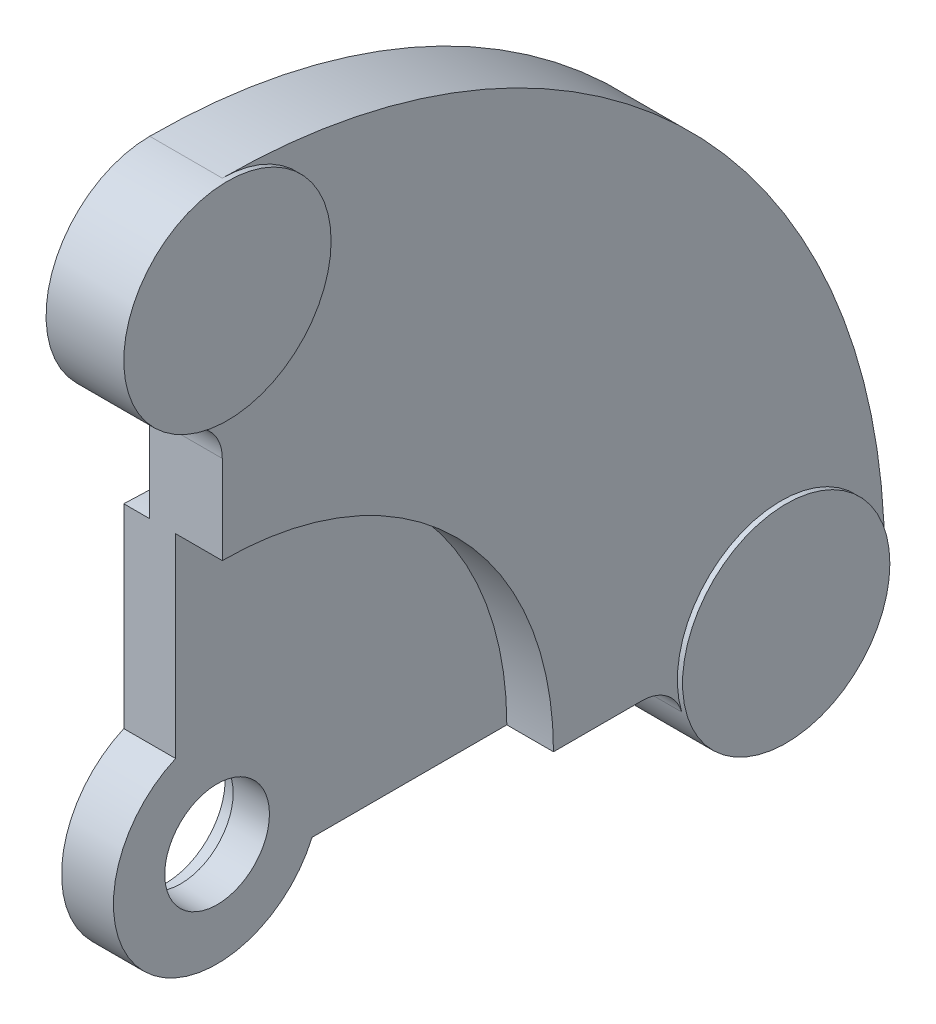
ISO-10303-21;
HEADER;
FILE_DESCRIPTION(('STEP AP214'),'2;1');
FILE_NAME('part.step','',(''),(''),'','','');
FILE_SCHEMA(('AUTOMOTIVE_DESIGN { 1 0 10303 214 1 1 1 1 }'));
ENDSEC;
DATA;
#1=APPLICATION_CONTEXT('core data for automotive mechanical design processes');
#2=APPLICATION_PROTOCOL_DEFINITION('international standard','automotive_design',2000,#1);
#3=PRODUCT_CONTEXT('',#1,'mechanical');
#4=PRODUCT('Part','Part','',(#3));
#5=PRODUCT_RELATED_PRODUCT_CATEGORY('part','',(#4));
#6=PRODUCT_DEFINITION_FORMATION('','',#4);
#7=PRODUCT_DEFINITION_CONTEXT('part definition',#1,'design');
#8=PRODUCT_DEFINITION('design','',#6,#7);
#9=PRODUCT_DEFINITION_SHAPE('','',#8);
#10=(LENGTH_UNIT() NAMED_UNIT(*) SI_UNIT(.MILLI.,.METRE.));
#11=(NAMED_UNIT(*) PLANE_ANGLE_UNIT() SI_UNIT($,.RADIAN.));
#12=(NAMED_UNIT(*) SI_UNIT($,.STERADIAN.) SOLID_ANGLE_UNIT());
#13=UNCERTAINTY_MEASURE_WITH_UNIT(LENGTH_MEASURE(1.E-05),#10,'distance_accuracy_value','');
#14=(GEOMETRIC_REPRESENTATION_CONTEXT(3) GLOBAL_UNCERTAINTY_ASSIGNED_CONTEXT((#13)) GLOBAL_UNIT_ASSIGNED_CONTEXT((#10,
#11,#12)) REPRESENTATION_CONTEXT('',''));
#15=CARTESIAN_POINT('',(0.,0.,0.));
#16=DIRECTION('',(0.,0.,1.));
#17=DIRECTION('',(1.,0.,0.));
#18=AXIS2_PLACEMENT_3D('',#15,#16,#17);
#19=CARTESIAN_POINT('',(-128.5,4.,-4.));
#20=DIRECTION('',(1.,0.,0.));
#21=DIRECTION('',(0.,0.,-1.));
#22=AXIS2_PLACEMENT_3D('',#19,#20,#21);
#23=CYLINDRICAL_SURFACE('',#22,5.05);
#24=CARTESIAN_POINT('',(2.5,4.,-4.));
#25=DIRECTION('',(1.,0.,0.));
#26=DIRECTION('',(0.,0.,-1.));
#27=AXIS2_PLACEMENT_3D('',#24,#25,#26);
#28=CIRCLE('',#27,5.05);
#29=CARTESIAN_POINT('',(2.5,4.,-9.05));
#30=VERTEX_POINT('',#29);
#31=EDGE_CURVE('E262',#30,#30,#28,.T.);
#32=ORIENTED_EDGE('',*,*,#31,.T.);
#33=EDGE_LOOP('',(#32));
#34=FACE_BOUND('',#33,.T.);
#35=CARTESIAN_POINT('',(-1.,4.,-4.));
#36=DIRECTION('',(-1.,0.,0.));
#37=DIRECTION('',(0.,0.,1.));
#38=AXIS2_PLACEMENT_3D('',#35,#36,#37);
#39=CIRCLE('',#38,5.05);
#40=CARTESIAN_POINT('',(-1.,4.,1.05));
#41=VERTEX_POINT('',#40);
#42=EDGE_CURVE('E53',#41,#41,#39,.F.);
#43=ORIENTED_EDGE('',*,*,#42,.F.);
#44=EDGE_LOOP('',(#43));
#45=FACE_BOUND('',#44,.T.);
#46=ADVANCED_FACE('F49',(#34,#45),#23,.F.);
#47=CARTESIAN_POINT('',(2.5,0.,0.));
#48=DIRECTION('',(-1.,0.,0.));
#49=DIRECTION('',(0.,0.,1.));
#50=AXIS2_PLACEMENT_3D('',#47,#48,#49);
#51=CYLINDRICAL_SURFACE('',#50,31.95);
#52=CARTESIAN_POINT('',(0.,0.,0.));
#53=DIRECTION('',(1.,0.,0.));
#54=DIRECTION('',(0.,0.,-1.));
#55=AXIS2_PLACEMENT_3D('',#52,#53,#54);
#56=CIRCLE('',#55,31.95);
#57=CARTESIAN_POINT('',(0.,0.,-31.95));
#58=VERTEX_POINT('',#57);
#59=CARTESIAN_POINT('',(0.,31.95,0.));
#60=VERTEX_POINT('',#59);
#61=EDGE_CURVE('E224',#58,#60,#56,.T.);
#62=ORIENTED_EDGE('',*,*,#61,.F.);
#63=DIRECTION('',(-1.,0.,0.));
#64=VECTOR('',#63,1.);
#65=CARTESIAN_POINT('',(2.5,0.,-31.95));
#66=LINE('',#65,#64);
#67=CARTESIAN_POINT('',(-2.5,0.,-31.95));
#68=VERTEX_POINT('',#67);
#69=EDGE_CURVE('E176',#58,#68,#66,.T.);
#70=ORIENTED_EDGE('',*,*,#69,.T.);
#71=CARTESIAN_POINT('',(-2.5,0.,0.));
#72=DIRECTION('',(1.,0.,0.));
#73=DIRECTION('',(0.,0.,-1.));
#74=AXIS2_PLACEMENT_3D('',#71,#72,#73);
#75=CIRCLE('',#74,31.95);
#76=CARTESIAN_POINT('',(-2.5,31.95,0.));
#77=VERTEX_POINT('',#76);
#78=EDGE_CURVE('E162',#68,#77,#75,.T.);
#79=ORIENTED_EDGE('',*,*,#78,.T.);
#80=DIRECTION('',(-1.,0.,0.));
#81=VECTOR('',#80,1.);
#82=CARTESIAN_POINT('',(2.5,31.95,0.));
#83=LINE('',#82,#81);
#84=EDGE_CURVE('E174',#60,#77,#83,.T.);
#85=ORIENTED_EDGE('',*,*,#84,.F.);
#86=EDGE_LOOP('',(#62,#70,#79,#85));
#87=FACE_BOUND('',#86,.T.);
#88=ADVANCED_FACE('F278',(#87),#51,.T.);
#89=CARTESIAN_POINT('',(2.5,0.,0.));
#90=DIRECTION('',(0.,1.,0.));
#91=DIRECTION('',(0.,0.,1.));
#92=AXIS2_PLACEMENT_3D('',#89,#90,#91);
#93=PLANE('',#92);
#94=DIRECTION('',(0.,0.,-1.));
#95=VECTOR('',#94,1.);
#96=CARTESIAN_POINT('',(2.5,0.,0.));
#97=LINE('',#96,#95);
#98=CARTESIAN_POINT('',(2.5,0.,-13.1651513899117));
#99=VERTEX_POINT('',#98);
#100=CARTESIAN_POINT('',(2.5,0.,-31.95));
#101=VERTEX_POINT('',#100);
#102=EDGE_CURVE('E156',#99,#101,#97,.T.);
#103=ORIENTED_EDGE('',*,*,#102,.F.);
#104=DIRECTION('',(1.,0.,0.));
#105=VECTOR('',#104,1.);
#106=CARTESIAN_POINT('',(-30.7842712474619,0.,-13.1651513899117));
#107=LINE('',#106,#105);
#108=CARTESIAN_POINT('',(-2.5,0.,-13.1651513899117));
#109=VERTEX_POINT('',#108);
#110=EDGE_CURVE('E139',#99,#109,#107,.F.);
#111=ORIENTED_EDGE('',*,*,#110,.T.);
#112=DIRECTION('',(0.,0.,-1.));
#113=VECTOR('',#112,1.);
#114=CARTESIAN_POINT('',(-2.5,0.,0.));
#115=LINE('',#114,#113);
#116=EDGE_CURVE('E153',#109,#68,#115,.T.);
#117=ORIENTED_EDGE('',*,*,#116,.T.);
#118=ORIENTED_EDGE('',*,*,#69,.F.);
#119=DIRECTION('',(0.,0.,-1.));
#120=VECTOR('',#119,1.);
#121=CARTESIAN_POINT('',(0.,0.,0.));
#122=LINE('',#121,#120);
#123=CARTESIAN_POINT('',(0.,0.,-40.4835921350013));
#124=VERTEX_POINT('',#123);
#125=EDGE_CURVE('E239',#58,#124,#122,.T.);
#126=ORIENTED_EDGE('',*,*,#125,.T.);
#127=DIRECTION('',(1.,0.,0.));
#128=VECTOR('',#127,1.);
#129=CARTESIAN_POINT('',(7.,0.,-40.4835921350013));
#130=LINE('',#129,#128);
#131=CARTESIAN_POINT('',(7.,0.,-40.4835921350013));
#132=VERTEX_POINT('',#131);
#133=EDGE_CURVE('E181',#124,#132,#130,.T.);
#134=ORIENTED_EDGE('',*,*,#133,.T.);
#135=DIRECTION('',(0.,0.,-1.));
#136=VECTOR('',#135,1.);
#137=CARTESIAN_POINT('',(7.,0.,0.));
#138=LINE('',#137,#136);
#139=CARTESIAN_POINT('',(7.,0.,-31.95));
#140=VERTEX_POINT('',#139);
#141=EDGE_CURVE('E201',#140,#132,#138,.T.);
#142=ORIENTED_EDGE('',*,*,#141,.F.);
#143=DIRECTION('',(-1.,0.,0.));
#144=VECTOR('',#143,1.);
#145=CARTESIAN_POINT('',(7.,0.,-31.95));
#146=LINE('',#145,#144);
#147=EDGE_CURVE('E163',#140,#101,#146,.T.);
#148=ORIENTED_EDGE('',*,*,#147,.T.);
#149=EDGE_LOOP('',(#103,#111,#117,#118,#126,#134,#142,#148));
#150=FACE_BOUND('',#149,.T.);
#151=ADVANCED_FACE('F151',(#150),#93,.F.);
#152=CARTESIAN_POINT('',(2.5,0.,0.));
#153=DIRECTION('',(0.,0.,-1.));
#154=DIRECTION('',(-1.,0.,0.));
#155=AXIS2_PLACEMENT_3D('',#152,#153,#154);
#156=PLANE('',#155);
#157=DIRECTION('',(0.,-1.,0.));
#158=VECTOR('',#157,1.);
#159=CARTESIAN_POINT('',(-2.5,0.,0.));
#160=LINE('',#159,#158);
#161=CARTESIAN_POINT('',(-2.5,13.1651513899117,0.));
#162=VERTEX_POINT('',#161);
#163=EDGE_CURVE('E165',#77,#162,#160,.T.);
#164=ORIENTED_EDGE('',*,*,#163,.T.);
#165=DIRECTION('',(1.,0.,0.));
#166=VECTOR('',#165,1.);
#167=CARTESIAN_POINT('',(-30.7842712474619,13.1651513899117,0.));
#168=LINE('',#167,#166);
#169=CARTESIAN_POINT('',(2.5,13.1651513899117,0.));
#170=VERTEX_POINT('',#169);
#171=EDGE_CURVE('E142',#162,#170,#168,.T.);
#172=ORIENTED_EDGE('',*,*,#171,.T.);
#173=DIRECTION('',(0.,-1.,0.));
#174=VECTOR('',#173,1.);
#175=CARTESIAN_POINT('',(2.5,0.,0.));
#176=LINE('',#175,#174);
#177=CARTESIAN_POINT('',(2.5,31.95,0.));
#178=VERTEX_POINT('',#177);
#179=EDGE_CURVE('E170',#178,#170,#176,.T.);
#180=ORIENTED_EDGE('',*,*,#179,.F.);
#181=DIRECTION('',(-1.,0.,0.));
#182=VECTOR('',#181,1.);
#183=CARTESIAN_POINT('',(7.,31.95,0.));
#184=LINE('',#183,#182);
#185=CARTESIAN_POINT('',(7.,31.95,0.));
#186=VERTEX_POINT('',#185);
#187=EDGE_CURVE('E237',#186,#178,#184,.T.);
#188=ORIENTED_EDGE('',*,*,#187,.F.);
#189=DIRECTION('',(0.,-1.,0.));
#190=VECTOR('',#189,1.);
#191=CARTESIAN_POINT('',(7.,0.,0.));
#192=LINE('',#191,#190);
#193=CARTESIAN_POINT('',(7.,40.4835921350013,0.));
#194=VERTEX_POINT('',#193);
#195=EDGE_CURVE('E235',#194,#186,#192,.T.);
#196=ORIENTED_EDGE('',*,*,#195,.F.);
#197=DIRECTION('',(1.,0.,0.));
#198=VECTOR('',#197,1.);
#199=CARTESIAN_POINT('',(0.,40.4835921350013,0.));
#200=LINE('',#199,#198);
#201=CARTESIAN_POINT('',(0.,40.4835921350013,0.));
#202=VERTEX_POINT('',#201);
#203=EDGE_CURVE('E183',#194,#202,#200,.F.);
#204=ORIENTED_EDGE('',*,*,#203,.T.);
#205=DIRECTION('',(0.,-1.,0.));
#206=VECTOR('',#205,1.);
#207=CARTESIAN_POINT('',(0.,0.,0.));
#208=LINE('',#207,#206);
#209=EDGE_CURVE('E229',#202,#60,#208,.T.);
#210=ORIENTED_EDGE('',*,*,#209,.T.);
#211=ORIENTED_EDGE('',*,*,#84,.T.);
#212=EDGE_LOOP('',(#164,#172,#180,#188,#196,#204,#210,#211));
#213=FACE_BOUND('',#212,.T.);
#214=ADVANCED_FACE('F257',(#213),#156,.F.);
#215=CARTESIAN_POINT('',(2.5,0.,0.));
#216=DIRECTION('',(1.,0.,0.));
#217=DIRECTION('',(0.,0.,-1.));
#218=AXIS2_PLACEMENT_3D('',#215,#216,#217);
#219=PLANE('',#218);
#220=ORIENTED_EDGE('',*,*,#31,.F.);
#221=EDGE_LOOP('',(#220));
#222=FACE_BOUND('',#221,.T.);
#223=CARTESIAN_POINT('',(2.5,4.,-4.));
#224=DIRECTION('',(1.,0.,0.));
#225=DIRECTION('',(0.,0.,-1.));
#226=AXIS2_PLACEMENT_3D('',#223,#224,#225);
#227=CIRCLE('',#226,10.);
#228=EDGE_CURVE('E147',#170,#99,#227,.T.);
#229=ORIENTED_EDGE('',*,*,#228,.T.);
#230=ORIENTED_EDGE('',*,*,#102,.T.);
#231=CARTESIAN_POINT('',(2.5,0.,0.));
#232=DIRECTION('',(1.,0.,0.));
#233=DIRECTION('',(0.,0.,-1.));
#234=AXIS2_PLACEMENT_3D('',#231,#232,#233);
#235=CIRCLE('',#234,31.95);
#236=EDGE_CURVE('E248',#101,#178,#235,.T.);
#237=ORIENTED_EDGE('',*,*,#236,.T.);
#238=ORIENTED_EDGE('',*,*,#179,.T.);
#239=EDGE_LOOP('',(#229,#230,#237,#238));
#240=FACE_BOUND('',#239,.T.);
#241=ADVANCED_FACE('F254',(#222,#240),#219,.T.);
#242=CARTESIAN_POINT('',(-2.5,0.,0.));
#243=DIRECTION('',(1.,0.,0.));
#244=DIRECTION('',(0.,0.,-1.));
#245=AXIS2_PLACEMENT_3D('',#242,#243,#244);
#246=PLANE('',#245);
#247=CARTESIAN_POINT('',(-2.5,4.,-4.));
#248=DIRECTION('',(-1.,0.,0.));
#249=DIRECTION('',(0.,0.,1.));
#250=AXIS2_PLACEMENT_3D('',#247,#248,#249);
#251=CIRCLE('',#250,5.78);
#252=CARTESIAN_POINT('',(-2.5,4.,1.78));
#253=VERTEX_POINT('',#252);
#254=EDGE_CURVE('E265',#253,#253,#251,.T.);
#255=ORIENTED_EDGE('',*,*,#254,.F.);
#256=EDGE_LOOP('',(#255));
#257=FACE_BOUND('',#256,.T.);
#258=ORIENTED_EDGE('',*,*,#116,.F.);
#259=CARTESIAN_POINT('',(-2.5,4.,-4.));
#260=DIRECTION('',(1.,0.,0.));
#261=DIRECTION('',(0.,0.,-1.));
#262=AXIS2_PLACEMENT_3D('',#259,#260,#261);
#263=CIRCLE('',#262,10.);
#264=EDGE_CURVE('E136',#109,#162,#263,.F.);
#265=ORIENTED_EDGE('',*,*,#264,.T.);
#266=ORIENTED_EDGE('',*,*,#163,.F.);
#267=ORIENTED_EDGE('',*,*,#78,.F.);
#268=EDGE_LOOP('',(#258,#265,#266,#267));
#269=FACE_BOUND('',#268,.T.);
#270=ADVANCED_FACE('F160',(#257,#269),#246,.F.);
#271=CARTESIAN_POINT('',(7.,0.,0.));
#272=DIRECTION('',(-1.,0.,0.));
#273=DIRECTION('',(0.,0.,1.));
#274=AXIS2_PLACEMENT_3D('',#271,#272,#273);
#275=CYLINDRICAL_SURFACE('',#274,31.95);
#276=ORIENTED_EDGE('',*,*,#187,.T.);
#277=ORIENTED_EDGE('',*,*,#236,.F.);
#278=ORIENTED_EDGE('',*,*,#147,.F.);
#279=CARTESIAN_POINT('',(7.,0.,0.));
#280=DIRECTION('',(1.,0.,0.));
#281=DIRECTION('',(0.,0.,-1.));
#282=AXIS2_PLACEMENT_3D('',#279,#280,#281);
#283=CIRCLE('',#282,31.95);
#284=EDGE_CURVE('E226',#140,#186,#283,.T.);
#285=ORIENTED_EDGE('',*,*,#284,.T.);
#286=EDGE_LOOP('',(#276,#277,#278,#285));
#287=FACE_BOUND('',#286,.T.);
#288=ADVANCED_FACE('F316',(#287),#275,.F.);
#289=CARTESIAN_POINT('',(7.,0.,0.));
#290=DIRECTION('',(-1.,0.,0.));
#291=DIRECTION('',(0.,0.,1.));
#292=AXIS2_PLACEMENT_3D('',#289,#290,#291);
#293=CYLINDRICAL_SURFACE('',#292,63.9);
#294=CARTESIAN_POINT('',(0.,0.,0.));
#295=DIRECTION('',(1.,0.,0.));
#296=DIRECTION('',(0.,0.,-1.));
#297=AXIS2_PLACEMENT_3D('',#294,#295,#296);
#298=CIRCLE('',#297,63.9);
#299=CARTESIAN_POINT('',(0.,0.,-63.9));
#300=VERTEX_POINT('',#299);
#301=CARTESIAN_POINT('',(0.,63.9,0.));
#302=VERTEX_POINT('',#301);
#303=EDGE_CURVE('E214',#300,#302,#298,.T.);
#304=ORIENTED_EDGE('',*,*,#303,.T.);
#305=DIRECTION('',(-1.,0.,0.));
#306=VECTOR('',#305,1.);
#307=CARTESIAN_POINT('',(7.,63.9,0.));
#308=LINE('',#307,#306);
#309=CARTESIAN_POINT('',(7.,63.9,0.));
#310=VERTEX_POINT('',#309);
#311=EDGE_CURVE('E244',#310,#302,#308,.T.);
#312=ORIENTED_EDGE('',*,*,#311,.F.);
#313=CARTESIAN_POINT('',(7.,0.,0.));
#314=DIRECTION('',(1.,0.,0.));
#315=DIRECTION('',(0.,0.,-1.));
#316=AXIS2_PLACEMENT_3D('',#313,#314,#315);
#317=CIRCLE('',#316,63.9);
#318=CARTESIAN_POINT('',(7.,0.,-63.9));
#319=VERTEX_POINT('',#318);
#320=EDGE_CURVE('E232',#319,#310,#317,.T.);
#321=ORIENTED_EDGE('',*,*,#320,.F.);
#322=DIRECTION('',(-1.,0.,0.));
#323=VECTOR('',#322,1.);
#324=CARTESIAN_POINT('',(7.,0.,-63.9));
#325=LINE('',#324,#323);
#326=EDGE_CURVE('E167',#319,#300,#325,.T.);
#327=ORIENTED_EDGE('',*,*,#326,.T.);
#328=EDGE_LOOP('',(#304,#312,#321,#327));
#329=FACE_BOUND('',#328,.T.);
#330=ADVANCED_FACE('F311',(#329),#293,.T.);
#331=CARTESIAN_POINT('',(7.,0.,0.));
#332=DIRECTION('',(1.,0.,0.));
#333=DIRECTION('',(0.,0.,-1.));
#334=AXIS2_PLACEMENT_3D('',#331,#332,#333);
#335=PLANE('',#334);
#336=ORIENTED_EDGE('',*,*,#284,.F.);
#337=ORIENTED_EDGE('',*,*,#141,.T.);
#338=CARTESIAN_POINT('',(7.,-4.,-40.4835921350013));
#339=DIRECTION('',(1.,0.,0.));
#340=DIRECTION('',(0.,0.,-1.));
#341=AXIS2_PLACEMENT_3D('',#338,#339,#340);
#342=CIRCLE('',#341,4.);
#343=CARTESIAN_POINT('',(7.,-2.85714285714286,-44.3168515250009));
#344=VERTEX_POINT('',#343);
#345=EDGE_CURVE('E190',#132,#344,#342,.F.);
#346=ORIENTED_EDGE('',*,*,#345,.T.);
#347=CARTESIAN_POINT('',(7.,0.,-53.9));
#348=DIRECTION('',(1.,0.,0.));
#349=DIRECTION('',(0.,0.,-1.));
#350=AXIS2_PLACEMENT_3D('',#347,#348,#349);
#351=CIRCLE('',#350,10.);
#352=EDGE_CURVE('E199',#319,#344,#351,.T.);
#353=ORIENTED_EDGE('',*,*,#352,.F.);
#354=ORIENTED_EDGE('',*,*,#320,.T.);
#355=CARTESIAN_POINT('',(7.,53.9,0.));
#356=DIRECTION('',(1.,0.,0.));
#357=DIRECTION('',(0.,0.,-1.));
#358=AXIS2_PLACEMENT_3D('',#355,#356,#357);
#359=CIRCLE('',#358,10.);
#360=CARTESIAN_POINT('',(7.,44.3168515250009,2.85714285714286));
#361=VERTEX_POINT('',#360);
#362=EDGE_CURVE('E64',#361,#310,#359,.T.);
#363=ORIENTED_EDGE('',*,*,#362,.F.);
#364=CARTESIAN_POINT('',(7.,40.4835921350013,4.));
#365=DIRECTION('',(1.,0.,0.));
#366=DIRECTION('',(0.,0.,-1.));
#367=AXIS2_PLACEMENT_3D('',#364,#365,#366);
#368=CIRCLE('',#367,4.);
#369=EDGE_CURVE('E11',#361,#194,#368,.F.);
#370=ORIENTED_EDGE('',*,*,#369,.T.);
#371=ORIENTED_EDGE('',*,*,#195,.T.);
#372=EDGE_LOOP('',(#336,#337,#346,#353,#354,#363,#370,#371));
#373=FACE_BOUND('',#372,.T.);
#374=ADVANCED_FACE('F198',(#373),#335,.T.);
#375=CARTESIAN_POINT('',(0.,0.,0.));
#376=DIRECTION('',(1.,0.,0.));
#377=DIRECTION('',(0.,0.,-1.));
#378=AXIS2_PLACEMENT_3D('',#375,#376,#377);
#379=PLANE('',#378);
#380=ORIENTED_EDGE('',*,*,#61,.T.);
#381=ORIENTED_EDGE('',*,*,#209,.F.);
#382=CARTESIAN_POINT('',(0.,40.4835921350013,4.));
#383=DIRECTION('',(1.,0.,0.));
#384=DIRECTION('',(0.,0.,-1.));
#385=AXIS2_PLACEMENT_3D('',#382,#383,#384);
#386=CIRCLE('',#385,4.);
#387=CARTESIAN_POINT('',(0.,44.3168515250009,2.85714285714286));
#388=VERTEX_POINT('',#387);
#389=EDGE_CURVE('E58',#202,#388,#386,.T.);
#390=ORIENTED_EDGE('',*,*,#389,.T.);
#391=CARTESIAN_POINT('',(0.,53.9,0.));
#392=DIRECTION('',(1.,0.,0.));
#393=DIRECTION('',(0.,0.,-1.));
#394=AXIS2_PLACEMENT_3D('',#391,#392,#393);
#395=CIRCLE('',#394,10.);
#396=EDGE_CURVE('E218',#302,#388,#395,.T.);
#397=ORIENTED_EDGE('',*,*,#396,.F.);
#398=ORIENTED_EDGE('',*,*,#303,.F.);
#399=CARTESIAN_POINT('',(0.,0.,-53.9));
#400=DIRECTION('',(1.,0.,0.));
#401=DIRECTION('',(0.,0.,-1.));
#402=AXIS2_PLACEMENT_3D('',#399,#400,#401);
#403=CIRCLE('',#402,10.);
#404=CARTESIAN_POINT('',(0.,-2.85714285714286,-44.3168515250009));
#405=VERTEX_POINT('',#404);
#406=EDGE_CURVE('E157',#405,#300,#403,.T.);
#407=ORIENTED_EDGE('',*,*,#406,.F.);
#408=CARTESIAN_POINT('',(0.,-4.,-40.4835921350013));
#409=DIRECTION('',(1.,0.,0.));
#410=DIRECTION('',(0.,0.,-1.));
#411=AXIS2_PLACEMENT_3D('',#408,#409,#410);
#412=CIRCLE('',#411,4.);
#413=EDGE_CURVE('E188',#405,#124,#412,.T.);
#414=ORIENTED_EDGE('',*,*,#413,.T.);
#415=ORIENTED_EDGE('',*,*,#125,.F.);
#416=EDGE_LOOP('',(#380,#381,#390,#397,#398,#407,#414,#415));
#417=FACE_BOUND('',#416,.T.);
#418=ADVANCED_FACE('F211',(#417),#379,.F.);
#419=CARTESIAN_POINT('',(7.5,53.9,0.));
#420=DIRECTION('',(-1.,0.,0.));
#421=DIRECTION('',(0.,0.,1.));
#422=AXIS2_PLACEMENT_3D('',#419,#420,#421);
#423=CYLINDRICAL_SURFACE('',#422,10.);
#424=CARTESIAN_POINT('',(7.5,53.9,0.));
#425=DIRECTION('',(1.,0.,0.));
#426=DIRECTION('',(0.,0.,-1.));
#427=AXIS2_PLACEMENT_3D('',#424,#425,#426);
#428=CIRCLE('',#427,10.);
#429=CARTESIAN_POINT('',(7.5,53.9,-10.));
#430=VERTEX_POINT('',#429);
#431=EDGE_CURVE('E221',#430,#430,#428,.T.);
#432=ORIENTED_EDGE('',*,*,#431,.F.);
#433=EDGE_LOOP('',(#432));
#434=FACE_BOUND('',#433,.T.);
#435=ORIENTED_EDGE('',*,*,#396,.T.);
#436=DIRECTION('',(-1.,0.,0.));
#437=VECTOR('',#436,1.);
#438=CARTESIAN_POINT('',(7.5,44.3168515250009,2.85714285714286));
#439=LINE('',#438,#437);
#440=EDGE_CURVE('E186',#388,#361,#439,.F.);
#441=ORIENTED_EDGE('',*,*,#440,.T.);
#442=ORIENTED_EDGE('',*,*,#362,.T.);
#443=ORIENTED_EDGE('',*,*,#311,.T.);
#444=EDGE_LOOP('',(#435,#441,#442,#443));
#445=FACE_BOUND('',#444,.T.);
#446=ADVANCED_FACE('F304',(#434,#445),#423,.T.);
#447=CARTESIAN_POINT('',(7.5,0.,0.));
#448=DIRECTION('',(1.,0.,0.));
#449=DIRECTION('',(0.,0.,-1.));
#450=AXIS2_PLACEMENT_3D('',#447,#448,#449);
#451=PLANE('',#450);
#452=ORIENTED_EDGE('',*,*,#431,.T.);
#453=EDGE_LOOP('',(#452));
#454=FACE_BOUND('',#453,.T.);
#455=ADVANCED_FACE('F300',(#454),#451,.T.);
#456=CARTESIAN_POINT('',(7.5,0.,-53.9));
#457=DIRECTION('',(-1.,0.,0.));
#458=DIRECTION('',(0.,0.,1.));
#459=AXIS2_PLACEMENT_3D('',#456,#457,#458);
#460=CYLINDRICAL_SURFACE('',#459,10.);
#461=CARTESIAN_POINT('',(7.5,0.,-53.9));
#462=DIRECTION('',(1.,0.,0.));
#463=DIRECTION('',(0.,0.,-1.));
#464=AXIS2_PLACEMENT_3D('',#461,#462,#463);
#465=CIRCLE('',#464,10.);
#466=CARTESIAN_POINT('',(7.5,0.,-63.9));
#467=VERTEX_POINT('',#466);
#468=EDGE_CURVE('E215',#467,#467,#465,.T.);
#469=ORIENTED_EDGE('',*,*,#468,.F.);
#470=EDGE_LOOP('',(#469));
#471=FACE_BOUND('',#470,.T.);
#472=ORIENTED_EDGE('',*,*,#352,.T.);
#473=DIRECTION('',(-1.,0.,0.));
#474=VECTOR('',#473,1.);
#475=CARTESIAN_POINT('',(7.5,-2.85714285714286,-44.3168515250009));
#476=LINE('',#475,#474);
#477=EDGE_CURVE('E178',#344,#405,#476,.T.);
#478=ORIENTED_EDGE('',*,*,#477,.T.);
#479=ORIENTED_EDGE('',*,*,#406,.T.);
#480=ORIENTED_EDGE('',*,*,#326,.F.);
#481=EDGE_LOOP('',(#472,#478,#479,#480));
#482=FACE_BOUND('',#481,.T.);
#483=ADVANCED_FACE('F207',(#471,#482),#460,.T.);
#484=CARTESIAN_POINT('',(7.5,0.,0.));
#485=DIRECTION('',(1.,0.,0.));
#486=DIRECTION('',(0.,0.,-1.));
#487=AXIS2_PLACEMENT_3D('',#484,#485,#486);
#488=PLANE('',#487);
#489=ORIENTED_EDGE('',*,*,#468,.T.);
#490=EDGE_LOOP('',(#489));
#491=FACE_BOUND('',#490,.T.);
#492=ADVANCED_FACE('F294',(#491),#488,.T.);
#493=CARTESIAN_POINT('',(7.5,-4.,-40.4835921350013));
#494=DIRECTION('',(-1.,0.,0.));
#495=DIRECTION('',(0.,0.,1.));
#496=AXIS2_PLACEMENT_3D('',#493,#494,#495);
#497=CYLINDRICAL_SURFACE('',#496,4.);
#498=ORIENTED_EDGE('',*,*,#345,.F.);
#499=ORIENTED_EDGE('',*,*,#133,.F.);
#500=ORIENTED_EDGE('',*,*,#413,.F.);
#501=ORIENTED_EDGE('',*,*,#477,.F.);
#502=EDGE_LOOP('',(#498,#499,#500,#501));
#503=FACE_BOUND('',#502,.T.);
#504=ADVANCED_FACE('F204',(#503),#497,.F.);
#505=CARTESIAN_POINT('',(7.5,40.4835921350013,4.));
#506=DIRECTION('',(-1.,0.,0.));
#507=DIRECTION('',(0.,0.,1.));
#508=AXIS2_PLACEMENT_3D('',#505,#506,#507);
#509=CYLINDRICAL_SURFACE('',#508,4.);
#510=ORIENTED_EDGE('',*,*,#369,.F.);
#511=ORIENTED_EDGE('',*,*,#440,.F.);
#512=ORIENTED_EDGE('',*,*,#389,.F.);
#513=ORIENTED_EDGE('',*,*,#203,.F.);
#514=EDGE_LOOP('',(#510,#511,#512,#513));
#515=FACE_BOUND('',#514,.T.);
#516=ADVANCED_FACE('F51',(#515),#509,.F.);
#517=CARTESIAN_POINT('',(-30.7842712474619,4.,-4.));
#518=DIRECTION('',(1.,0.,0.));
#519=DIRECTION('',(0.,0.,-1.));
#520=AXIS2_PLACEMENT_3D('',#517,#518,#519);
#521=CYLINDRICAL_SURFACE('',#520,10.);
#522=ORIENTED_EDGE('',*,*,#110,.F.);
#523=ORIENTED_EDGE('',*,*,#228,.F.);
#524=ORIENTED_EDGE('',*,*,#171,.F.);
#525=ORIENTED_EDGE('',*,*,#264,.F.);
#526=EDGE_LOOP('',(#522,#523,#524,#525));
#527=FACE_BOUND('',#526,.T.);
#528=ADVANCED_FACE('F138',(#527),#521,.T.);
#529=CARTESIAN_POINT('',(-1.,4.,-4.));
#530=DIRECTION('',(-1.,0.,0.));
#531=DIRECTION('',(0.,0.,1.));
#532=AXIS2_PLACEMENT_3D('',#529,#530,#531);
#533=PLANE('',#532);
#534=CARTESIAN_POINT('',(-1.,4.,-4.));
#535=DIRECTION('',(-1.,0.,0.));
#536=DIRECTION('',(0.,0.,1.));
#537=AXIS2_PLACEMENT_3D('',#534,#535,#536);
#538=CIRCLE('',#537,5.78);
#539=CARTESIAN_POINT('',(-1.,4.,1.78));
#540=VERTEX_POINT('',#539);
#541=EDGE_CURVE('E268',#540,#540,#538,.T.);
#542=ORIENTED_EDGE('',*,*,#541,.T.);
#543=EDGE_LOOP('',(#542));
#544=FACE_BOUND('',#543,.T.);
#545=ORIENTED_EDGE('',*,*,#42,.T.);
#546=EDGE_LOOP('',(#545));
#547=FACE_BOUND('',#546,.T.);
#548=ADVANCED_FACE('F275',(#544,#547),#533,.T.);
#549=CARTESIAN_POINT('',(-1.,4.,-4.));
#550=DIRECTION('',(-1.,0.,0.));
#551=DIRECTION('',(0.,0.,1.));
#552=AXIS2_PLACEMENT_3D('',#549,#550,#551);
#553=CYLINDRICAL_SURFACE('',#552,5.78);
#554=ORIENTED_EDGE('',*,*,#541,.F.);
#555=EDGE_LOOP('',(#554));
#556=FACE_BOUND('',#555,.T.);
#557=ORIENTED_EDGE('',*,*,#254,.T.);
#558=EDGE_LOOP('',(#557));
#559=FACE_BOUND('',#558,.T.);
#560=ADVANCED_FACE('F290',(#556,#559),#553,.F.);
#561=CLOSED_SHELL('',(#46,#88,#151,#214,#241,#270,#288,#330,#374,#418,#446,#455,#483,#492,#504,
#516,#528,#548,#560));
#562=MANIFOLD_SOLID_BREP('B2',#561);
#563=ADVANCED_BREP_SHAPE_REPRESENTATION('',(#18,#562),#14);
#564=SHAPE_DEFINITION_REPRESENTATION(#9,#563);
ENDSEC;
END-ISO-10303-21;
